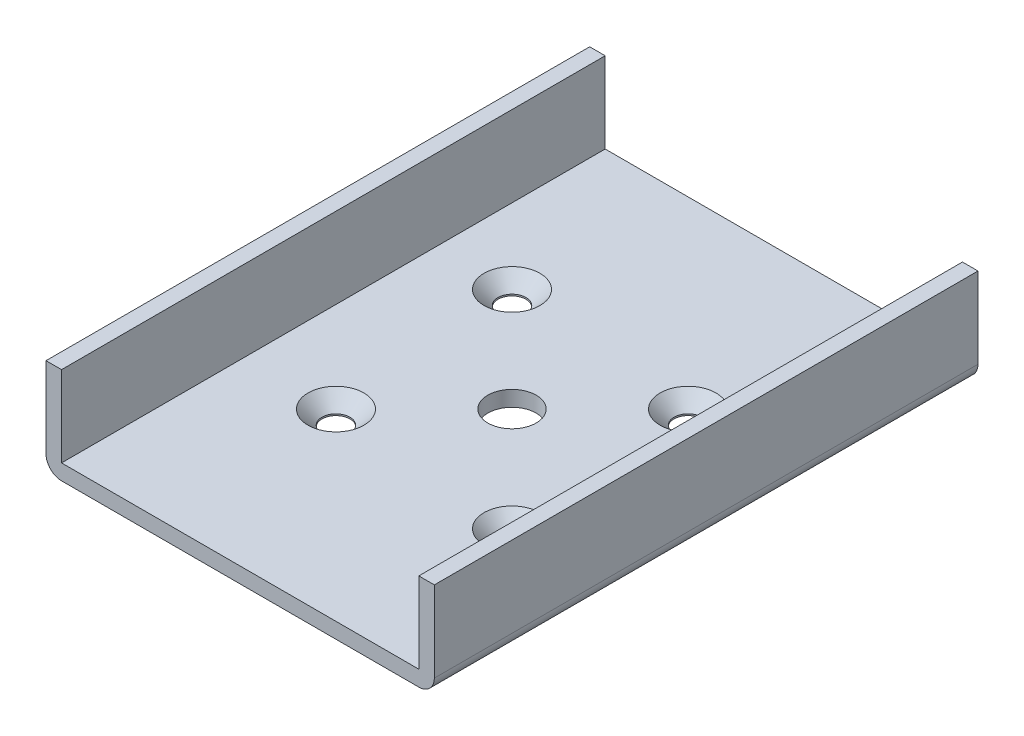
ISO-10303-21;
HEADER;
FILE_DESCRIPTION(('STEP AP214'),'2;1');
FILE_NAME('part.step','',(''),(''),'','','');
FILE_SCHEMA(('AUTOMOTIVE_DESIGN { 1 0 10303 214 1 1 1 1 }'));
ENDSEC;
DATA;
#1=APPLICATION_CONTEXT('core data for automotive mechanical design processes');
#2=APPLICATION_PROTOCOL_DEFINITION('international standard','automotive_design',2000,#1);
#3=PRODUCT_CONTEXT('',#1,'mechanical');
#4=PRODUCT('Part','Part','',(#3));
#5=PRODUCT_RELATED_PRODUCT_CATEGORY('part','',(#4));
#6=PRODUCT_DEFINITION_FORMATION('','',#4);
#7=PRODUCT_DEFINITION_CONTEXT('part definition',#1,'design');
#8=PRODUCT_DEFINITION('design','',#6,#7);
#9=PRODUCT_DEFINITION_SHAPE('','',#8);
#10=(LENGTH_UNIT() NAMED_UNIT(*) SI_UNIT(.MILLI.,.METRE.));
#11=(NAMED_UNIT(*) PLANE_ANGLE_UNIT() SI_UNIT($,.RADIAN.));
#12=(NAMED_UNIT(*) SI_UNIT($,.STERADIAN.) SOLID_ANGLE_UNIT());
#13=UNCERTAINTY_MEASURE_WITH_UNIT(LENGTH_MEASURE(1.E-05),#10,'distance_accuracy_value','');
#14=(GEOMETRIC_REPRESENTATION_CONTEXT(3) GLOBAL_UNCERTAINTY_ASSIGNED_CONTEXT((#13)) GLOBAL_UNIT_ASSIGNED_CONTEXT((#10,
#11,#12)) REPRESENTATION_CONTEXT('',''));
#15=CARTESIAN_POINT('',(0.,0.,0.));
#16=DIRECTION('',(0.,0.,1.));
#17=DIRECTION('',(1.,0.,0.));
#18=AXIS2_PLACEMENT_3D('',#15,#16,#17);
#19=CARTESIAN_POINT('',(12.5,1.,35.));
#20=DIRECTION('',(-1.,0.,0.));
#21=DIRECTION('',(0.,-1.,0.));
#22=AXIS2_PLACEMENT_3D('',#19,#20,#21);
#23=PLANE('',#22);
#24=DIRECTION('',(0.,1.,0.));
#25=VECTOR('',#24,1.);
#26=CARTESIAN_POINT('',(12.5,1.,0.));
#27=LINE('',#26,#25);
#28=CARTESIAN_POINT('',(12.5,1.,0.));
#29=VERTEX_POINT('',#28);
#30=CARTESIAN_POINT('',(12.5,6.2,0.));
#31=VERTEX_POINT('',#30);
#32=EDGE_CURVE('E149',#29,#31,#27,.T.);
#33=ORIENTED_EDGE('',*,*,#32,.T.);
#34=DIRECTION('',(0.,0.,-1.));
#35=VECTOR('',#34,1.);
#36=CARTESIAN_POINT('',(12.5,6.2,35.));
#37=LINE('',#36,#35);
#38=CARTESIAN_POINT('',(12.5,6.2,35.));
#39=VERTEX_POINT('',#38);
#40=EDGE_CURVE('E11',#39,#31,#37,.T.);
#41=ORIENTED_EDGE('',*,*,#40,.F.);
#42=DIRECTION('',(0.,1.,0.));
#43=VECTOR('',#42,1.);
#44=CARTESIAN_POINT('',(12.5,1.,35.));
#45=LINE('',#44,#43);
#46=CARTESIAN_POINT('',(12.5,1.,35.));
#47=VERTEX_POINT('',#46);
#48=EDGE_CURVE('E103',#47,#39,#45,.T.);
#49=ORIENTED_EDGE('',*,*,#48,.F.);
#50=DIRECTION('',(0.,0.,-1.));
#51=VECTOR('',#50,1.);
#52=CARTESIAN_POINT('',(12.5,1.,35.));
#53=LINE('',#52,#51);
#54=EDGE_CURVE('E145',#47,#29,#53,.T.);
#55=ORIENTED_EDGE('',*,*,#54,.T.);
#56=EDGE_LOOP('',(#33,#41,#49,#55));
#57=FACE_BOUND('',#56,.T.);
#58=ADVANCED_FACE('F39',(#57),#23,.F.);
#59=CARTESIAN_POINT('',(11.5,6.2,35.));
#60=DIRECTION('',(0.,1.,0.));
#61=DIRECTION('',(0.,0.,1.));
#62=AXIS2_PLACEMENT_3D('',#59,#60,#61);
#63=PLANE('',#62);
#64=DIRECTION('',(1.,0.,0.));
#65=VECTOR('',#64,1.);
#66=CARTESIAN_POINT('',(11.5,6.2,0.));
#67=LINE('',#66,#65);
#68=CARTESIAN_POINT('',(11.5,6.2,0.));
#69=VERTEX_POINT('',#68);
#70=EDGE_CURVE('E152',#69,#31,#67,.T.);
#71=ORIENTED_EDGE('',*,*,#70,.F.);
#72=DIRECTION('',(0.,0.,-1.));
#73=VECTOR('',#72,1.);
#74=CARTESIAN_POINT('',(11.5,6.2,35.));
#75=LINE('',#74,#73);
#76=CARTESIAN_POINT('',(11.5,6.2,35.));
#77=VERTEX_POINT('',#76);
#78=EDGE_CURVE('E48',#77,#69,#75,.T.);
#79=ORIENTED_EDGE('',*,*,#78,.F.);
#80=DIRECTION('',(1.,0.,0.));
#81=VECTOR('',#80,1.);
#82=CARTESIAN_POINT('',(11.5,6.2,35.));
#83=LINE('',#82,#81);
#84=EDGE_CURVE('E222',#77,#39,#83,.T.);
#85=ORIENTED_EDGE('',*,*,#84,.T.);
#86=ORIENTED_EDGE('',*,*,#40,.T.);
#87=EDGE_LOOP('',(#71,#79,#85,#86));
#88=FACE_BOUND('',#87,.T.);
#89=ADVANCED_FACE('F261',(#88),#63,.T.);
#90=CARTESIAN_POINT('',(11.5,1.,35.));
#91=DIRECTION('',(-1.,0.,0.));
#92=DIRECTION('',(0.,-1.,0.));
#93=AXIS2_PLACEMENT_3D('',#90,#91,#92);
#94=PLANE('',#93);
#95=DIRECTION('',(0.,1.,0.));
#96=VECTOR('',#95,1.);
#97=CARTESIAN_POINT('',(11.5,1.,0.));
#98=LINE('',#97,#96);
#99=CARTESIAN_POINT('',(11.5,1.,0.));
#100=VERTEX_POINT('',#99);
#101=EDGE_CURVE('E156',#100,#69,#98,.T.);
#102=ORIENTED_EDGE('',*,*,#101,.F.);
#103=DIRECTION('',(0.,0.,-1.));
#104=VECTOR('',#103,1.);
#105=CARTESIAN_POINT('',(11.5,1.,35.));
#106=LINE('',#105,#104);
#107=CARTESIAN_POINT('',(11.5,1.,35.));
#108=VERTEX_POINT('',#107);
#109=EDGE_CURVE('E182',#108,#100,#106,.T.);
#110=ORIENTED_EDGE('',*,*,#109,.F.);
#111=DIRECTION('',(0.,1.,0.));
#112=VECTOR('',#111,1.);
#113=CARTESIAN_POINT('',(11.5,1.,35.));
#114=LINE('',#113,#112);
#115=EDGE_CURVE('E225',#108,#77,#114,.T.);
#116=ORIENTED_EDGE('',*,*,#115,.T.);
#117=ORIENTED_EDGE('',*,*,#78,.T.);
#118=EDGE_LOOP('',(#102,#110,#116,#117));
#119=FACE_BOUND('',#118,.T.);
#120=ADVANCED_FACE('F266',(#119),#94,.T.);
#121=CARTESIAN_POINT('',(-11.5,1.,35.));
#122=DIRECTION('',(0.,1.,0.));
#123=DIRECTION('',(-1.,0.,0.));
#124=AXIS2_PLACEMENT_3D('',#121,#122,#123);
#125=PLANE('',#124);
#126=CARTESIAN_POINT('',(5.66654161239453,1.00000000000001,11.8334583876054));
#127=DIRECTION('',(0.,1.,0.));
#128=DIRECTION('',(0.,0.,1.));
#129=AXIS2_PLACEMENT_3D('',#126,#127,#128);
#130=CIRCLE('',#129,1.8);
#131=CARTESIAN_POINT('',(5.66654161239453,1.00000000000001,13.6334583876054));
#132=VERTEX_POINT('',#131);
#133=EDGE_CURVE('E287',#132,#132,#130,.T.);
#134=ORIENTED_EDGE('',*,*,#133,.F.);
#135=EDGE_LOOP('',(#134));
#136=FACE_BOUND('',#135,.T.);
#137=CARTESIAN_POINT('',(6.67233029795418,1.00000000000001,24.1723302979544));
#138=DIRECTION('',(0.,1.,0.));
#139=DIRECTION('',(0.,0.,1.));
#140=AXIS2_PLACEMENT_3D('',#137,#138,#139);
#141=CIRCLE('',#140,1.8);
#142=CARTESIAN_POINT('',(6.67233029795418,1.00000000000001,25.9723302979544));
#143=VERTEX_POINT('',#142);
#144=EDGE_CURVE('E205',#143,#143,#141,.T.);
#145=ORIENTED_EDGE('',*,*,#144,.F.);
#146=EDGE_LOOP('',(#145));
#147=FACE_BOUND('',#146,.T.);
#148=CARTESIAN_POINT('',(-5.66654161239482,1.,23.1665416123946));
#149=DIRECTION('',(0.,1.,0.));
#150=DIRECTION('',(0.,0.,1.));
#151=AXIS2_PLACEMENT_3D('',#148,#149,#150);
#152=CIRCLE('',#151,1.8);
#153=CARTESIAN_POINT('',(-5.66654161239482,1.,24.9665416123946));
#154=VERTEX_POINT('',#153);
#155=EDGE_CURVE('E198',#154,#154,#152,.T.);
#156=ORIENTED_EDGE('',*,*,#155,.F.);
#157=EDGE_LOOP('',(#156));
#158=FACE_BOUND('',#157,.T.);
#159=CARTESIAN_POINT('',(-6.67233029795448,1.,10.8276697020456));
#160=DIRECTION('',(0.,1.,0.));
#161=DIRECTION('',(0.,0.,1.));
#162=AXIS2_PLACEMENT_3D('',#159,#160,#161);
#163=CIRCLE('',#162,1.8);
#164=CARTESIAN_POINT('',(-6.67233029795448,1.,12.6276697020456));
#165=VERTEX_POINT('',#164);
#166=EDGE_CURVE('E194',#165,#165,#163,.T.);
#167=ORIENTED_EDGE('',*,*,#166,.F.);
#168=EDGE_LOOP('',(#167));
#169=FACE_BOUND('',#168,.T.);
#170=CARTESIAN_POINT('',(0.,1.,17.5000000000001));
#171=DIRECTION('',(0.,1.,0.));
#172=DIRECTION('',(-1.,0.,0.));
#173=AXIS2_PLACEMENT_3D('',#170,#171,#172);
#174=CIRCLE('',#173,1.55575000000001);
#175=CARTESIAN_POINT('',(-1.55574999999997,1.,17.5000000000001));
#176=VERTEX_POINT('',#175);
#177=EDGE_CURVE('E187',#176,#176,#174,.T.);
#178=ORIENTED_EDGE('',*,*,#177,.F.);
#179=EDGE_LOOP('',(#178));
#180=FACE_BOUND('',#179,.T.);
#181=DIRECTION('',(1.,0.,0.));
#182=VECTOR('',#181,1.);
#183=CARTESIAN_POINT('',(-11.5,1.,0.));
#184=LINE('',#183,#182);
#185=CARTESIAN_POINT('',(-11.5,1.,0.));
#186=VERTEX_POINT('',#185);
#187=EDGE_CURVE('E159',#186,#100,#184,.T.);
#188=ORIENTED_EDGE('',*,*,#187,.F.);
#189=DIRECTION('',(0.,0.,-1.));
#190=VECTOR('',#189,1.);
#191=CARTESIAN_POINT('',(-11.5,1.,35.));
#192=LINE('',#191,#190);
#193=CARTESIAN_POINT('',(-11.5,1.,35.));
#194=VERTEX_POINT('',#193);
#195=EDGE_CURVE('E180',#194,#186,#192,.T.);
#196=ORIENTED_EDGE('',*,*,#195,.F.);
#197=DIRECTION('',(1.,0.,0.));
#198=VECTOR('',#197,1.);
#199=CARTESIAN_POINT('',(-11.5,1.,35.));
#200=LINE('',#199,#198);
#201=EDGE_CURVE('E228',#194,#108,#200,.T.);
#202=ORIENTED_EDGE('',*,*,#201,.T.);
#203=ORIENTED_EDGE('',*,*,#109,.T.);
#204=EDGE_LOOP('',(#188,#196,#202,#203));
#205=FACE_BOUND('',#204,.T.);
#206=ADVANCED_FACE('F272',(#136,#147,#158,#169,#180,#205),#125,.T.);
#207=CARTESIAN_POINT('',(-11.5,6.2,35.));
#208=DIRECTION('',(1.,0.,0.));
#209=DIRECTION('',(0.,0.,-1.));
#210=AXIS2_PLACEMENT_3D('',#207,#208,#209);
#211=PLANE('',#210);
#212=DIRECTION('',(0.,1.,0.));
#213=VECTOR('',#212,1.);
#214=CARTESIAN_POINT('',(-11.5,6.2,0.));
#215=LINE('',#214,#213);
#216=CARTESIAN_POINT('',(-11.5,6.2,0.));
#217=VERTEX_POINT('',#216);
#218=EDGE_CURVE('E162',#217,#186,#215,.F.);
#219=ORIENTED_EDGE('',*,*,#218,.F.);
#220=DIRECTION('',(0.,0.,-1.));
#221=VECTOR('',#220,1.);
#222=CARTESIAN_POINT('',(-11.5,6.2,35.));
#223=LINE('',#222,#221);
#224=CARTESIAN_POINT('',(-11.5,6.2,35.));
#225=VERTEX_POINT('',#224);
#226=EDGE_CURVE('E178',#225,#217,#223,.T.);
#227=ORIENTED_EDGE('',*,*,#226,.F.);
#228=DIRECTION('',(0.,1.,0.));
#229=VECTOR('',#228,1.);
#230=CARTESIAN_POINT('',(-11.5,6.2,35.));
#231=LINE('',#230,#229);
#232=EDGE_CURVE('E231',#225,#194,#231,.F.);
#233=ORIENTED_EDGE('',*,*,#232,.T.);
#234=ORIENTED_EDGE('',*,*,#195,.T.);
#235=EDGE_LOOP('',(#219,#227,#233,#234));
#236=FACE_BOUND('',#235,.T.);
#237=ADVANCED_FACE('F244',(#236),#211,.T.);
#238=CARTESIAN_POINT('',(-12.5,6.2,35.));
#239=DIRECTION('',(0.,1.,0.));
#240=DIRECTION('',(0.,0.,1.));
#241=AXIS2_PLACEMENT_3D('',#238,#239,#240);
#242=PLANE('',#241);
#243=DIRECTION('',(1.,0.,0.));
#244=VECTOR('',#243,1.);
#245=CARTESIAN_POINT('',(-12.5,6.2,0.));
#246=LINE('',#245,#244);
#247=CARTESIAN_POINT('',(-12.5,6.2,0.));
#248=VERTEX_POINT('',#247);
#249=EDGE_CURVE('E165',#248,#217,#246,.T.);
#250=ORIENTED_EDGE('',*,*,#249,.F.);
#251=DIRECTION('',(0.,0.,-1.));
#252=VECTOR('',#251,1.);
#253=CARTESIAN_POINT('',(-12.5,6.2,35.));
#254=LINE('',#253,#252);
#255=CARTESIAN_POINT('',(-12.5,6.2,35.));
#256=VERTEX_POINT('',#255);
#257=EDGE_CURVE('E176',#256,#248,#254,.T.);
#258=ORIENTED_EDGE('',*,*,#257,.F.);
#259=DIRECTION('',(1.,0.,0.));
#260=VECTOR('',#259,1.);
#261=CARTESIAN_POINT('',(-12.5,6.2,35.));
#262=LINE('',#261,#260);
#263=EDGE_CURVE('E234',#256,#225,#262,.T.);
#264=ORIENTED_EDGE('',*,*,#263,.T.);
#265=ORIENTED_EDGE('',*,*,#226,.T.);
#266=EDGE_LOOP('',(#250,#258,#264,#265));
#267=FACE_BOUND('',#266,.T.);
#268=ADVANCED_FACE('F238',(#267),#242,.T.);
#269=CARTESIAN_POINT('',(-12.5,6.2,35.));
#270=DIRECTION('',(1.,0.,0.));
#271=DIRECTION('',(0.,0.,-1.));
#272=AXIS2_PLACEMENT_3D('',#269,#270,#271);
#273=PLANE('',#272);
#274=DIRECTION('',(0.,-1.,0.));
#275=VECTOR('',#274,1.);
#276=CARTESIAN_POINT('',(-12.5,6.2,0.));
#277=LINE('',#276,#275);
#278=CARTESIAN_POINT('',(-12.5,0.999999999999996,0.));
#279=VERTEX_POINT('',#278);
#280=EDGE_CURVE('E168',#248,#279,#277,.T.);
#281=ORIENTED_EDGE('',*,*,#280,.T.);
#282=DIRECTION('',(0.,0.,-1.));
#283=VECTOR('',#282,1.);
#284=CARTESIAN_POINT('',(-12.5,0.999999999999996,35.));
#285=LINE('',#284,#283);
#286=CARTESIAN_POINT('',(-12.5,0.999999999999996,35.));
#287=VERTEX_POINT('',#286);
#288=EDGE_CURVE('E140',#287,#279,#285,.T.);
#289=ORIENTED_EDGE('',*,*,#288,.F.);
#290=DIRECTION('',(0.,-1.,0.));
#291=VECTOR('',#290,1.);
#292=CARTESIAN_POINT('',(-12.5,6.2,35.));
#293=LINE('',#292,#291);
#294=EDGE_CURVE('E131',#256,#287,#293,.T.);
#295=ORIENTED_EDGE('',*,*,#294,.F.);
#296=ORIENTED_EDGE('',*,*,#257,.T.);
#297=EDGE_LOOP('',(#281,#289,#295,#296));
#298=FACE_BOUND('',#297,.T.);
#299=ADVANCED_FACE('F251',(#298),#273,.F.);
#300=CARTESIAN_POINT('',(-11.5,0.999999999999996,35.));
#301=DIRECTION('',(0.,0.,-1.));
#302=DIRECTION('',(-1.,0.,0.));
#303=AXIS2_PLACEMENT_3D('',#300,#301,#302);
#304=CYLINDRICAL_SURFACE('',#303,0.999999999999998);
#305=CARTESIAN_POINT('',(-11.5,0.999999999999996,0.));
#306=DIRECTION('',(0.,0.,1.));
#307=DIRECTION('',(1.,0.,0.));
#308=AXIS2_PLACEMENT_3D('',#305,#306,#307);
#309=CIRCLE('',#308,0.999999999999998);
#310=CARTESIAN_POINT('',(-11.5,0.,0.));
#311=VERTEX_POINT('',#310);
#312=EDGE_CURVE('E139',#279,#311,#309,.T.);
#313=ORIENTED_EDGE('',*,*,#312,.T.);
#314=DIRECTION('',(0.,0.,-1.));
#315=VECTOR('',#314,1.);
#316=CARTESIAN_POINT('',(-11.5,0.,35.));
#317=LINE('',#316,#315);
#318=CARTESIAN_POINT('',(-11.5,0.,35.));
#319=VERTEX_POINT('',#318);
#320=EDGE_CURVE('E136',#319,#311,#317,.T.);
#321=ORIENTED_EDGE('',*,*,#320,.F.);
#322=CARTESIAN_POINT('',(-11.5,0.999999999999996,35.));
#323=DIRECTION('',(0.,0.,1.));
#324=DIRECTION('',(1.,0.,0.));
#325=AXIS2_PLACEMENT_3D('',#322,#323,#324);
#326=CIRCLE('',#325,0.999999999999998);
#327=EDGE_CURVE('E124',#287,#319,#326,.T.);
#328=ORIENTED_EDGE('',*,*,#327,.F.);
#329=ORIENTED_EDGE('',*,*,#288,.T.);
#330=EDGE_LOOP('',(#313,#321,#328,#329));
#331=FACE_BOUND('',#330,.T.);
#332=ADVANCED_FACE('F137',(#331),#304,.T.);
#333=CARTESIAN_POINT('',(-11.5,0.,35.));
#334=DIRECTION('',(0.,1.,0.));
#335=DIRECTION('',(-1.,0.,0.));
#336=AXIS2_PLACEMENT_3D('',#333,#334,#335);
#337=PLANE('',#336);
#338=CARTESIAN_POINT('',(5.66654161239453,0.,11.8334583876054));
#339=DIRECTION('',(0.,1.,0.));
#340=DIRECTION('',(-1.,0.,0.));
#341=AXIS2_PLACEMENT_3D('',#338,#339,#340);
#342=CIRCLE('',#341,0.899999999999979);
#343=CARTESIAN_POINT('',(4.76654161239455,0.,11.8334583876054));
#344=VERTEX_POINT('',#343);
#345=EDGE_CURVE('E42',#344,#344,#342,.T.);
#346=ORIENTED_EDGE('',*,*,#345,.T.);
#347=EDGE_LOOP('',(#346));
#348=FACE_BOUND('',#347,.T.);
#349=CARTESIAN_POINT('',(6.67233029795418,0.,24.1723302979544));
#350=DIRECTION('',(0.,1.,0.));
#351=DIRECTION('',(-1.,0.,0.));
#352=AXIS2_PLACEMENT_3D('',#349,#350,#351);
#353=CIRCLE('',#352,0.899999999999979);
#354=CARTESIAN_POINT('',(5.7723302979542,0.,24.1723302979544));
#355=VERTEX_POINT('',#354);
#356=EDGE_CURVE('E196',#355,#355,#353,.T.);
#357=ORIENTED_EDGE('',*,*,#356,.T.);
#358=EDGE_LOOP('',(#357));
#359=FACE_BOUND('',#358,.T.);
#360=CARTESIAN_POINT('',(-5.66654161239482,0.,23.1665416123946));
#361=DIRECTION('',(0.,1.,0.));
#362=DIRECTION('',(-1.,0.,0.));
#363=AXIS2_PLACEMENT_3D('',#360,#361,#362);
#364=CIRCLE('',#363,0.899999999999979);
#365=CARTESIAN_POINT('',(-6.5665416123948,0.,23.1665416123946));
#366=VERTEX_POINT('',#365);
#367=EDGE_CURVE('E192',#366,#366,#364,.T.);
#368=ORIENTED_EDGE('',*,*,#367,.T.);
#369=EDGE_LOOP('',(#368));
#370=FACE_BOUND('',#369,.T.);
#371=CARTESIAN_POINT('',(-6.67233029795448,0.,10.8276697020456));
#372=DIRECTION('',(0.,1.,0.));
#373=DIRECTION('',(-1.,0.,0.));
#374=AXIS2_PLACEMENT_3D('',#371,#372,#373);
#375=CIRCLE('',#374,0.899999999999979);
#376=CARTESIAN_POINT('',(-7.57233029795446,0.,10.8276697020456));
#377=VERTEX_POINT('',#376);
#378=EDGE_CURVE('E188',#377,#377,#375,.T.);
#379=ORIENTED_EDGE('',*,*,#378,.T.);
#380=EDGE_LOOP('',(#379));
#381=FACE_BOUND('',#380,.T.);
#382=CARTESIAN_POINT('',(0.,0.,17.5000000000001));
#383=DIRECTION('',(0.,1.,0.));
#384=DIRECTION('',(-1.,0.,0.));
#385=AXIS2_PLACEMENT_3D('',#382,#383,#384);
#386=CIRCLE('',#385,1.55575000000001);
#387=CARTESIAN_POINT('',(-1.55574999999997,0.,17.5000000000001));
#388=VERTEX_POINT('',#387);
#389=EDGE_CURVE('E153',#388,#388,#386,.T.);
#390=ORIENTED_EDGE('',*,*,#389,.T.);
#391=EDGE_LOOP('',(#390));
#392=FACE_BOUND('',#391,.T.);
#393=DIRECTION('',(1.,0.,0.));
#394=VECTOR('',#393,1.);
#395=CARTESIAN_POINT('',(-11.5,0.,0.));
#396=LINE('',#395,#394);
#397=CARTESIAN_POINT('',(11.5,0.,0.));
#398=VERTEX_POINT('',#397);
#399=EDGE_CURVE('E91',#311,#398,#396,.T.);
#400=ORIENTED_EDGE('',*,*,#399,.T.);
#401=DIRECTION('',(0.,0.,-1.));
#402=VECTOR('',#401,1.);
#403=CARTESIAN_POINT('',(11.5,0.,35.));
#404=LINE('',#403,#402);
#405=CARTESIAN_POINT('',(11.5,0.,35.));
#406=VERTEX_POINT('',#405);
#407=EDGE_CURVE('E141',#406,#398,#404,.T.);
#408=ORIENTED_EDGE('',*,*,#407,.F.);
#409=DIRECTION('',(1.,0.,0.));
#410=VECTOR('',#409,1.);
#411=CARTESIAN_POINT('',(-11.5,0.,35.));
#412=LINE('',#411,#410);
#413=EDGE_CURVE('E128',#319,#406,#412,.T.);
#414=ORIENTED_EDGE('',*,*,#413,.F.);
#415=ORIENTED_EDGE('',*,*,#320,.T.);
#416=EDGE_LOOP('',(#400,#408,#414,#415));
#417=FACE_BOUND('',#416,.T.);
#418=ADVANCED_FACE('F143',(#348,#359,#370,#381,#392,#417),#337,.F.);
#419=CARTESIAN_POINT('',(11.5,1.,35.));
#420=DIRECTION('',(0.,0.,-1.));
#421=DIRECTION('',(-1.,0.,0.));
#422=AXIS2_PLACEMENT_3D('',#419,#420,#421);
#423=CYLINDRICAL_SURFACE('',#422,0.999999999999998);
#424=CARTESIAN_POINT('',(11.5,1.,0.));
#425=DIRECTION('',(0.,0.,1.));
#426=DIRECTION('',(1.,0.,0.));
#427=AXIS2_PLACEMENT_3D('',#424,#425,#426);
#428=CIRCLE('',#427,0.999999999999998);
#429=EDGE_CURVE('E97',#398,#29,#428,.T.);
#430=ORIENTED_EDGE('',*,*,#429,.T.);
#431=ORIENTED_EDGE('',*,*,#54,.F.);
#432=CARTESIAN_POINT('',(11.5,1.,35.));
#433=DIRECTION('',(0.,0.,1.));
#434=DIRECTION('',(1.,0.,0.));
#435=AXIS2_PLACEMENT_3D('',#432,#433,#434);
#436=CIRCLE('',#435,0.999999999999998);
#437=EDGE_CURVE('E57',#406,#47,#436,.T.);
#438=ORIENTED_EDGE('',*,*,#437,.F.);
#439=ORIENTED_EDGE('',*,*,#407,.T.);
#440=EDGE_LOOP('',(#430,#431,#438,#439));
#441=FACE_BOUND('',#440,.T.);
#442=ADVANCED_FACE('F303',(#441),#423,.T.);
#443=CARTESIAN_POINT('',(-11.5,0.999999999999996,35.));
#444=DIRECTION('',(0.,0.,1.));
#445=DIRECTION('',(1.,0.,0.));
#446=AXIS2_PLACEMENT_3D('',#443,#444,#445);
#447=PLANE('',#446);
#448=ORIENTED_EDGE('',*,*,#48,.T.);
#449=ORIENTED_EDGE('',*,*,#84,.F.);
#450=ORIENTED_EDGE('',*,*,#115,.F.);
#451=ORIENTED_EDGE('',*,*,#201,.F.);
#452=ORIENTED_EDGE('',*,*,#232,.F.);
#453=ORIENTED_EDGE('',*,*,#263,.F.);
#454=ORIENTED_EDGE('',*,*,#294,.T.);
#455=ORIENTED_EDGE('',*,*,#327,.T.);
#456=ORIENTED_EDGE('',*,*,#413,.T.);
#457=ORIENTED_EDGE('',*,*,#437,.T.);
#458=EDGE_LOOP('',(#448,#449,#450,#451,#452,#453,#454,#455,#456,#457));
#459=FACE_BOUND('',#458,.T.);
#460=ADVANCED_FACE('F126',(#459),#447,.T.);
#461=CARTESIAN_POINT('',(-11.5,0.999999999999996,0.));
#462=DIRECTION('',(0.,0.,1.));
#463=DIRECTION('',(1.,0.,0.));
#464=AXIS2_PLACEMENT_3D('',#461,#462,#463);
#465=PLANE('',#464);
#466=ORIENTED_EDGE('',*,*,#32,.F.);
#467=ORIENTED_EDGE('',*,*,#429,.F.);
#468=ORIENTED_EDGE('',*,*,#399,.F.);
#469=ORIENTED_EDGE('',*,*,#312,.F.);
#470=ORIENTED_EDGE('',*,*,#280,.F.);
#471=ORIENTED_EDGE('',*,*,#249,.T.);
#472=ORIENTED_EDGE('',*,*,#218,.T.);
#473=ORIENTED_EDGE('',*,*,#187,.T.);
#474=ORIENTED_EDGE('',*,*,#101,.T.);
#475=ORIENTED_EDGE('',*,*,#70,.T.);
#476=EDGE_LOOP('',(#466,#467,#468,#469,#470,#471,#472,#473,#474,#475));
#477=FACE_BOUND('',#476,.T.);
#478=ADVANCED_FACE('F249',(#477),#465,.F.);
#479=CARTESIAN_POINT('',(0.,-5.87352549932416,17.5000000000001));
#480=DIRECTION('',(0.,1.,0.));
#481=DIRECTION('',(-1.,0.,0.));
#482=AXIS2_PLACEMENT_3D('',#479,#480,#481);
#483=CYLINDRICAL_SURFACE('',#482,1.55575000000001);
#484=CARTESIAN_POINT('',(-1.55574999999997,1.,17.5000000000001));
#485=CARTESIAN_POINT('',(-1.55574999999997,0.989583333333335,17.5000000000001));
#486=CARTESIAN_POINT('',(-1.55574999999997,0.979166666666668,17.5000000000001));
#487=CARTESIAN_POINT('',(-1.55574999999997,0.958333333333335,17.5000000000001));
#488=CARTESIAN_POINT('',(-1.55574999999997,0.947916666666668,17.5000000000001));
#489=CARTESIAN_POINT('',(-1.55574999999997,0.927083333333335,17.5000000000001));
#490=CARTESIAN_POINT('',(-1.55574999999997,0.916666666666668,17.5000000000001));
#491=CARTESIAN_POINT('',(-1.55574999999997,0.895833333333335,17.5000000000001));
#492=CARTESIAN_POINT('',(-1.55574999999997,0.885416666666668,17.5000000000001));
#493=CARTESIAN_POINT('',(-1.55574999999997,0.864583333333335,17.5000000000001));
#494=CARTESIAN_POINT('',(-1.55574999999997,0.854166666666668,17.5000000000001));
#495=CARTESIAN_POINT('',(-1.55574999999997,0.833333333333335,17.5000000000001));
#496=CARTESIAN_POINT('',(-1.55574999999997,0.822916666666668,17.5000000000001));
#497=CARTESIAN_POINT('',(-1.55574999999997,0.802083333333335,17.5000000000001));
#498=CARTESIAN_POINT('',(-1.55574999999997,0.791666666666668,17.5000000000001));
#499=CARTESIAN_POINT('',(-1.55574999999997,0.770833333333335,17.5000000000001));
#500=CARTESIAN_POINT('',(-1.55574999999997,0.760416666666668,17.5000000000001));
#501=CARTESIAN_POINT('',(-1.55574999999997,0.739583333333335,17.5000000000001));
#502=CARTESIAN_POINT('',(-1.55574999999997,0.729166666666668,17.5000000000001));
#503=CARTESIAN_POINT('',(-1.55574999999997,0.708333333333335,17.5000000000001));
#504=CARTESIAN_POINT('',(-1.55574999999997,0.697916666666668,17.5000000000001));
#505=CARTESIAN_POINT('',(-1.55574999999997,0.677083333333335,17.5000000000001));
#506=CARTESIAN_POINT('',(-1.55574999999997,0.666666666666668,17.5000000000001));
#507=CARTESIAN_POINT('',(-1.55574999999997,0.645833333333335,17.5000000000001));
#508=CARTESIAN_POINT('',(-1.55574999999997,0.635416666666668,17.5000000000001));
#509=CARTESIAN_POINT('',(-1.55574999999997,0.614583333333335,17.5000000000001));
#510=CARTESIAN_POINT('',(-1.55574999999997,0.604166666666668,17.5000000000001));
#511=CARTESIAN_POINT('',(-1.55574999999997,0.583333333333335,17.5000000000001));
#512=CARTESIAN_POINT('',(-1.55574999999997,0.572916666666668,17.5000000000001));
#513=CARTESIAN_POINT('',(-1.55574999999997,0.552083333333335,17.5000000000001));
#514=CARTESIAN_POINT('',(-1.55574999999997,0.541666666666668,17.5000000000001));
#515=CARTESIAN_POINT('',(-1.55574999999997,0.520833333333335,17.5000000000001));
#516=CARTESIAN_POINT('',(-1.55574999999997,0.510416666666668,17.5000000000001));
#517=CARTESIAN_POINT('',(-1.55574999999997,0.489583333333335,17.5000000000001));
#518=CARTESIAN_POINT('',(-1.55574999999997,0.479166666666668,17.5000000000001));
#519=CARTESIAN_POINT('',(-1.55574999999997,0.458333333333335,17.5000000000001));
#520=CARTESIAN_POINT('',(-1.55574999999997,0.447916666666668,17.5000000000001));
#521=CARTESIAN_POINT('',(-1.55574999999997,0.427083333333335,17.5000000000001));
#522=CARTESIAN_POINT('',(-1.55574999999997,0.416666666666668,17.5000000000001));
#523=CARTESIAN_POINT('',(-1.55574999999997,0.395833333333335,17.5000000000001));
#524=CARTESIAN_POINT('',(-1.55574999999997,0.385416666666668,17.5000000000001));
#525=CARTESIAN_POINT('',(-1.55574999999997,0.364583333333335,17.5000000000001));
#526=CARTESIAN_POINT('',(-1.55574999999997,0.354166666666668,17.5000000000001));
#527=CARTESIAN_POINT('',(-1.55574999999997,0.333333333333335,17.5000000000001));
#528=CARTESIAN_POINT('',(-1.55574999999997,0.322916666666668,17.5000000000001));
#529=CARTESIAN_POINT('',(-1.55574999999997,0.302083333333334,17.5000000000001));
#530=CARTESIAN_POINT('',(-1.55574999999997,0.291666666666668,17.5000000000001));
#531=CARTESIAN_POINT('',(-1.55574999999997,0.270833333333334,17.5000000000001));
#532=CARTESIAN_POINT('',(-1.55574999999997,0.260416666666668,17.5000000000001));
#533=CARTESIAN_POINT('',(-1.55574999999997,0.239583333333334,17.5000000000001));
#534=CARTESIAN_POINT('',(-1.55574999999997,0.229166666666668,17.5000000000001));
#535=CARTESIAN_POINT('',(-1.55574999999997,0.208333333333334,17.5000000000001));
#536=CARTESIAN_POINT('',(-1.55574999999997,0.197916666666668,17.5000000000001));
#537=CARTESIAN_POINT('',(-1.55574999999997,0.177083333333334,17.5000000000001));
#538=CARTESIAN_POINT('',(-1.55574999999997,0.166666666666668,17.5000000000001));
#539=CARTESIAN_POINT('',(-1.55574999999997,0.145833333333334,17.5000000000001));
#540=CARTESIAN_POINT('',(-1.55574999999997,0.135416666666668,17.5000000000001));
#541=CARTESIAN_POINT('',(-1.55574999999997,0.114583333333334,17.5000000000001));
#542=CARTESIAN_POINT('',(-1.55574999999997,0.104166666666668,17.5000000000001));
#543=CARTESIAN_POINT('',(-1.55574999999997,0.0833333333333343,17.5000000000001));
#544=CARTESIAN_POINT('',(-1.55574999999997,0.0729166666666676,17.5000000000001));
#545=CARTESIAN_POINT('',(-1.55574999999997,0.0520833333333343,17.5000000000001));
#546=CARTESIAN_POINT('',(-1.55574999999997,0.0416666666666676,17.5000000000001));
#547=CARTESIAN_POINT('',(-1.55574999999997,0.0208333333333342,17.5000000000001));
#548=CARTESIAN_POINT('',(-1.55574999999997,0.0104166666666675,17.5000000000001));
#549=CARTESIAN_POINT('',(-1.55574999999997,0.,17.5000000000001));
#550=B_SPLINE_CURVE_WITH_KNOTS('',3,(#484,#485,#486,#487,#488,#489,#490,#491,#492,#493,#494,
#495,#496,#497,#498,#499,#500,#501,#502,#503,#504,#505,#506,#507,#508,#509,#510,#511,#512,#513,
#514,#515,#516,#517,#518,#519,#520,#521,#522,#523,#524,#525,#526,#527,#528,#529,#530,#531,#532,
#533,#534,#535,#536,#537,#538,#539,#540,#541,#542,#543,#544,#545,#546,#547,#548,#549),
.UNSPECIFIED.,.F.,.F.,(4,2,2,2,2,2,2,2,2,2,2,2,2,2,2,2,2,2,2,2,2,2,2,2,2,2,2,2,2,2,2,2,4),(0.,
0.03125,0.0625000000000001,0.0937500000000001,0.125,0.15625,0.1875,0.21875,0.25,0.28125,0.3125,
0.34375,0.375,0.40625,0.4375,0.46875,0.5,0.53125,0.5625,0.593750000000001,0.625000000000001,
0.656250000000001,0.687500000000001,0.718750000000001,0.750000000000001,0.781250000000001,
0.812500000000001,0.843750000000001,0.875000000000001,0.906250000000001,0.937500000000001,
0.968750000000001,1.),.UNSPECIFIED.);
#551=EDGE_CURVE('BSEAM296',#176,#388,#550,.T.);
#552=ORIENTED_EDGE('',*,*,#177,.T.);
#553=ORIENTED_EDGE('',*,*,#389,.F.);
#554=ORIENTED_EDGE('',*,*,#551,.T.);
#555=ORIENTED_EDGE('',*,*,#551,.F.);
#556=EDGE_LOOP('',(#552,#554,#553,#555));
#557=FACE_BOUND('',#556,.T.);
#558=ADVANCED_FACE('F296',(#557),#483,.F.);
#559=CARTESIAN_POINT('',(-6.67233029795448,1.,10.8276697020456));
#560=DIRECTION('',(0.,1.,0.));
#561=DIRECTION('',(0.,0.,1.));
#562=AXIS2_PLACEMENT_3D('',#559,#560,#561);
#563=CYLINDRICAL_SURFACE('',#562,0.899999999999979);
#564=CARTESIAN_POINT('',(-6.67233029795448,0.099999999999989,10.8276697020456));
#565=DIRECTION('',(0.,1.,0.));
#566=DIRECTION('',(0.,0.,1.));
#567=AXIS2_PLACEMENT_3D('',#564,#565,#566);
#568=CIRCLE('',#567,0.899999999999985);
#569=CARTESIAN_POINT('',(-6.67233029795448,0.099999999999989,11.7276697020456));
#570=VERTEX_POINT('',#569);
#571=EDGE_CURVE('E191',#570,#570,#568,.T.);
#572=ORIENTED_EDGE('',*,*,#571,.T.);
#573=EDGE_LOOP('',(#572));
#574=FACE_BOUND('',#573,.T.);
#575=ORIENTED_EDGE('',*,*,#378,.F.);
#576=EDGE_LOOP('',(#575));
#577=FACE_BOUND('',#576,.T.);
#578=ADVANCED_FACE('F299',(#574,#577),#563,.F.);
#579=CARTESIAN_POINT('',(-6.67233029795448,1.,10.8276697020456));
#580=DIRECTION('',(0.,1.,0.));
#581=DIRECTION('',(0.,0.,1.));
#582=AXIS2_PLACEMENT_3D('',#579,#580,#581);
#583=CONICAL_SURFACE('',#582,1.8,0.785398163397449);
#584=ORIENTED_EDGE('',*,*,#571,.F.);
#585=EDGE_LOOP('',(#584));
#586=FACE_BOUND('',#585,.T.);
#587=ORIENTED_EDGE('',*,*,#166,.T.);
#588=EDGE_LOOP('',(#587));
#589=FACE_BOUND('',#588,.T.);
#590=ADVANCED_FACE('F319',(#586,#589),#583,.F.);
#591=CARTESIAN_POINT('',(-5.66654161239482,1.,23.1665416123946));
#592=DIRECTION('',(0.,1.,0.));
#593=DIRECTION('',(0.,0.,1.));
#594=AXIS2_PLACEMENT_3D('',#591,#592,#593);
#595=CYLINDRICAL_SURFACE('',#594,0.899999999999979);
#596=CARTESIAN_POINT('',(-5.66654161239482,0.0999999999999892,23.1665416123946));
#597=DIRECTION('',(0.,1.,0.));
#598=DIRECTION('',(0.,0.,1.));
#599=AXIS2_PLACEMENT_3D('',#596,#597,#598);
#600=CIRCLE('',#599,0.899999999999985);
#601=CARTESIAN_POINT('',(-5.66654161239482,0.0999999999999892,24.0665416123946));
#602=VERTEX_POINT('',#601);
#603=EDGE_CURVE('E195',#602,#602,#600,.T.);
#604=ORIENTED_EDGE('',*,*,#603,.T.);
#605=EDGE_LOOP('',(#604));
#606=FACE_BOUND('',#605,.T.);
#607=ORIENTED_EDGE('',*,*,#367,.F.);
#608=EDGE_LOOP('',(#607));
#609=FACE_BOUND('',#608,.T.);
#610=ADVANCED_FACE('F323',(#606,#609),#595,.F.);
#611=CARTESIAN_POINT('',(-5.66654161239482,1.,23.1665416123946));
#612=DIRECTION('',(0.,1.,0.));
#613=DIRECTION('',(0.,0.,1.));
#614=AXIS2_PLACEMENT_3D('',#611,#612,#613);
#615=CONICAL_SURFACE('',#614,1.8,0.785398163397449);
#616=ORIENTED_EDGE('',*,*,#603,.F.);
#617=EDGE_LOOP('',(#616));
#618=FACE_BOUND('',#617,.T.);
#619=ORIENTED_EDGE('',*,*,#155,.T.);
#620=EDGE_LOOP('',(#619));
#621=FACE_BOUND('',#620,.T.);
#622=ADVANCED_FACE('F327',(#618,#621),#615,.F.);
#623=CARTESIAN_POINT('',(6.67233029795418,1.,24.1723302979544));
#624=DIRECTION('',(0.,1.,0.));
#625=DIRECTION('',(0.,0.,1.));
#626=AXIS2_PLACEMENT_3D('',#623,#624,#625);
#627=CYLINDRICAL_SURFACE('',#626,0.899999999999979);
#628=CARTESIAN_POINT('',(6.67233029795418,0.0999999999999916,24.1723302979544));
#629=DIRECTION('',(0.,1.,0.));
#630=DIRECTION('',(0.,0.,1.));
#631=AXIS2_PLACEMENT_3D('',#628,#629,#630);
#632=CIRCLE('',#631,0.899999999999985);
#633=CARTESIAN_POINT('',(6.67233029795418,0.0999999999999916,25.0723302979544));
#634=VERTEX_POINT('',#633);
#635=EDGE_CURVE('E199',#634,#634,#632,.T.);
#636=ORIENTED_EDGE('',*,*,#635,.T.);
#637=EDGE_LOOP('',(#636));
#638=FACE_BOUND('',#637,.T.);
#639=ORIENTED_EDGE('',*,*,#356,.F.);
#640=EDGE_LOOP('',(#639));
#641=FACE_BOUND('',#640,.T.);
#642=ADVANCED_FACE('F331',(#638,#641),#627,.F.);
#643=CARTESIAN_POINT('',(6.67233029795418,1.00000000000001,24.1723302979544));
#644=DIRECTION('',(0.,1.,0.));
#645=DIRECTION('',(0.,0.,1.));
#646=AXIS2_PLACEMENT_3D('',#643,#644,#645);
#647=CONICAL_SURFACE('',#646,1.8,0.785398163397449);
#648=ORIENTED_EDGE('',*,*,#635,.F.);
#649=EDGE_LOOP('',(#648));
#650=FACE_BOUND('',#649,.T.);
#651=ORIENTED_EDGE('',*,*,#144,.T.);
#652=EDGE_LOOP('',(#651));
#653=FACE_BOUND('',#652,.T.);
#654=ADVANCED_FACE('F335',(#650,#653),#647,.F.);
#655=CARTESIAN_POINT('',(5.66654161239453,1.,11.8334583876054));
#656=DIRECTION('',(0.,1.,0.));
#657=DIRECTION('',(0.,0.,1.));
#658=AXIS2_PLACEMENT_3D('',#655,#656,#657);
#659=CYLINDRICAL_SURFACE('',#658,0.899999999999979);
#660=CARTESIAN_POINT('',(5.66654161239453,0.0999999999999914,11.8334583876054));
#661=DIRECTION('',(0.,1.,0.));
#662=DIRECTION('',(0.,0.,1.));
#663=AXIS2_PLACEMENT_3D('',#660,#661,#662);
#664=CIRCLE('',#663,0.899999999999985);
#665=CARTESIAN_POINT('',(5.66654161239453,0.0999999999999914,12.7334583876054));
#666=VERTEX_POINT('',#665);
#667=EDGE_CURVE('E351',#666,#666,#664,.T.);
#668=ORIENTED_EDGE('',*,*,#667,.T.);
#669=EDGE_LOOP('',(#668));
#670=FACE_BOUND('',#669,.T.);
#671=ORIENTED_EDGE('',*,*,#345,.F.);
#672=EDGE_LOOP('',(#671));
#673=FACE_BOUND('',#672,.T.);
#674=ADVANCED_FACE('F338',(#670,#673),#659,.F.);
#675=CARTESIAN_POINT('',(5.66654161239453,1.00000000000001,11.8334583876054));
#676=DIRECTION('',(0.,1.,0.));
#677=DIRECTION('',(0.,0.,1.));
#678=AXIS2_PLACEMENT_3D('',#675,#676,#677);
#679=CONICAL_SURFACE('',#678,1.8,0.785398163397449);
#680=ORIENTED_EDGE('',*,*,#667,.F.);
#681=EDGE_LOOP('',(#680));
#682=FACE_BOUND('',#681,.T.);
#683=ORIENTED_EDGE('',*,*,#133,.T.);
#684=EDGE_LOOP('',(#683));
#685=FACE_BOUND('',#684,.T.);
#686=ADVANCED_FACE('F342',(#682,#685),#679,.F.);
#687=CLOSED_SHELL('',(#58,#89,#120,#206,#237,#268,#299,#332,#418,#442,#460,#478,#558,#578,#590,
#610,#622,#642,#654,#674,#686));
#688=MANIFOLD_SOLID_BREP('B2',#687);
#689=ADVANCED_BREP_SHAPE_REPRESENTATION('',(#18,#688),#14);
#690=SHAPE_DEFINITION_REPRESENTATION(#9,#689);
ENDSEC;
END-ISO-10303-21;
